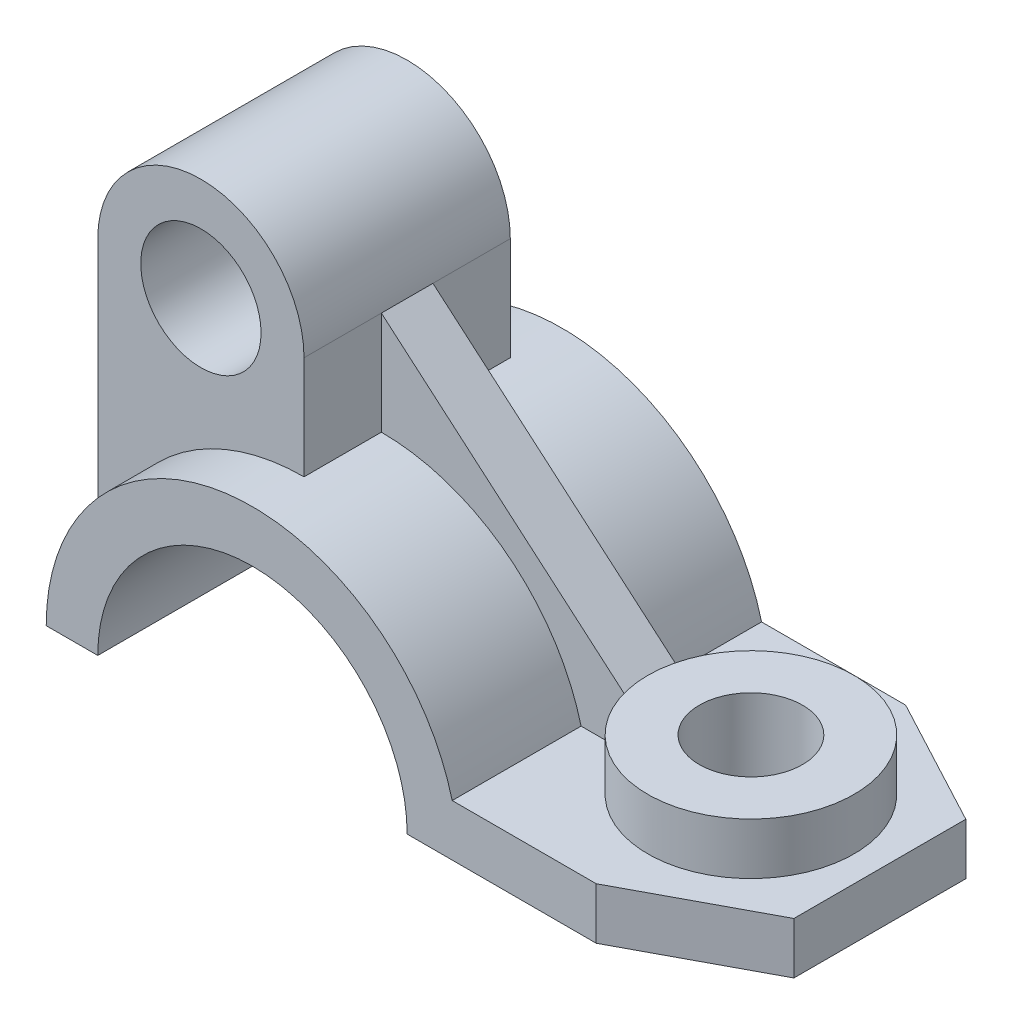
ISO-10303-21;
HEADER;
FILE_DESCRIPTION(('STEP AP214'),'2;1');
FILE_NAME('part.step','',(''),(''),'','','');
FILE_SCHEMA(('AUTOMOTIVE_DESIGN { 1 0 10303 214 1 1 1 1 }'));
ENDSEC;
DATA;
#1=APPLICATION_CONTEXT('core data for automotive mechanical design processes');
#2=APPLICATION_PROTOCOL_DEFINITION('international standard','automotive_design',2000,#1);
#3=PRODUCT_CONTEXT('',#1,'mechanical');
#4=PRODUCT('Part','Part','',(#3));
#5=PRODUCT_RELATED_PRODUCT_CATEGORY('part','',(#4));
#6=PRODUCT_DEFINITION_FORMATION('','',#4);
#7=PRODUCT_DEFINITION_CONTEXT('part definition',#1,'design');
#8=PRODUCT_DEFINITION('design','',#6,#7);
#9=PRODUCT_DEFINITION_SHAPE('','',#8);
#10=(LENGTH_UNIT() NAMED_UNIT(*) SI_UNIT(.MILLI.,.METRE.));
#11=(NAMED_UNIT(*) PLANE_ANGLE_UNIT() SI_UNIT($,.RADIAN.));
#12=(NAMED_UNIT(*) SI_UNIT($,.STERADIAN.) SOLID_ANGLE_UNIT());
#13=UNCERTAINTY_MEASURE_WITH_UNIT(LENGTH_MEASURE(1.E-05),#10,'distance_accuracy_value','');
#14=(GEOMETRIC_REPRESENTATION_CONTEXT(3) GLOBAL_UNCERTAINTY_ASSIGNED_CONTEXT((#13)) GLOBAL_UNIT_ASSIGNED_CONTEXT((#10,
#11,#12)) REPRESENTATION_CONTEXT('',''));
#15=CARTESIAN_POINT('',(0.,0.,0.));
#16=DIRECTION('',(0.,0.,1.));
#17=DIRECTION('',(1.,0.,0.));
#18=AXIS2_PLACEMENT_3D('',#15,#16,#17);
#19=CARTESIAN_POINT('',(0.,0.,18.));
#20=DIRECTION('',(0.,0.,-1.));
#21=DIRECTION('',(-1.,0.,0.));
#22=AXIS2_PLACEMENT_3D('',#19,#20,#21);
#23=CYLINDRICAL_SURFACE('',#22,24.);
#24=CARTESIAN_POINT('',(0.,0.,-3.));
#25=DIRECTION('',(0.,0.,1.));
#26=DIRECTION('',(1.,0.,0.));
#27=AXIS2_PLACEMENT_3D('',#24,#25,#26);
#28=CIRCLE('',#27,24.);
#29=CARTESIAN_POINT('',(23.2379000772445,5.99999999999999,-3.));
#30=VERTEX_POINT('',#29);
#31=CARTESIAN_POINT('',(0.,24.,-3.));
#32=VERTEX_POINT('',#31);
#33=EDGE_CURVE('E189',#30,#32,#28,.T.);
#34=ORIENTED_EDGE('',*,*,#33,.F.);
#35=DIRECTION('',(0.,0.,-1.));
#36=VECTOR('',#35,1.);
#37=CARTESIAN_POINT('',(23.2379000772445,5.99999999999999,18.));
#38=LINE('',#37,#36);
#39=CARTESIAN_POINT('',(23.2379000772445,5.99999999999999,-18.));
#40=VERTEX_POINT('',#39);
#41=EDGE_CURVE('E185',#30,#40,#38,.T.);
#42=ORIENTED_EDGE('',*,*,#41,.T.);
#43=CARTESIAN_POINT('',(0.,0.,-18.));
#44=DIRECTION('',(0.,0.,1.));
#45=DIRECTION('',(1.,0.,0.));
#46=AXIS2_PLACEMENT_3D('',#43,#44,#45);
#47=CIRCLE('',#46,24.);
#48=CARTESIAN_POINT('',(-24.,0.,-18.));
#49=VERTEX_POINT('',#48);
#50=EDGE_CURVE('E277',#40,#49,#47,.T.);
#51=ORIENTED_EDGE('',*,*,#50,.T.);
#52=DIRECTION('',(0.,0.,-1.));
#53=VECTOR('',#52,1.);
#54=CARTESIAN_POINT('',(-24.,0.,18.));
#55=LINE('',#54,#53);
#56=CARTESIAN_POINT('',(-24.,0.,-12.));
#57=VERTEX_POINT('',#56);
#58=EDGE_CURVE('E286',#57,#49,#55,.T.);
#59=ORIENTED_EDGE('',*,*,#58,.F.);
#60=CARTESIAN_POINT('',(0.,0.,-12.));
#61=DIRECTION('',(0.,0.,1.));
#62=DIRECTION('',(1.,0.,0.));
#63=AXIS2_PLACEMENT_3D('',#60,#61,#62);
#64=CIRCLE('',#63,24.);
#65=CARTESIAN_POINT('',(0.,24.,-12.));
#66=VERTEX_POINT('',#65);
#67=EDGE_CURVE('E393',#66,#57,#64,.T.);
#68=ORIENTED_EDGE('',*,*,#67,.F.);
#69=DIRECTION('',(0.,0.,-1.));
#70=VECTOR('',#69,1.);
#71=CARTESIAN_POINT('',(0.,24.,12.));
#72=LINE('',#71,#70);
#73=EDGE_CURVE('E350',#32,#66,#72,.T.);
#74=ORIENTED_EDGE('',*,*,#73,.F.);
#75=EDGE_LOOP('',(#34,#42,#51,#59,#68,#74));
#76=FACE_BOUND('',#75,.T.);
#77=ADVANCED_FACE('F47',(#76),#23,.T.);
#78=CARTESIAN_POINT('',(-2.54856103348659E-13,0.,12.));
#79=DIRECTION('',(1.,0.,0.));
#80=DIRECTION('',(0.,1.,0.));
#81=AXIS2_PLACEMENT_3D('',#78,#79,#80);
#82=PLANE('',#81);
#83=DIRECTION('',(0.,0.,-1.));
#84=VECTOR('',#83,1.);
#85=CARTESIAN_POINT('',(0.,36.,12.));
#86=LINE('',#85,#84);
#87=CARTESIAN_POINT('',(0.,36.,-3.));
#88=VERTEX_POINT('',#87);
#89=CARTESIAN_POINT('',(0.,36.,-12.));
#90=VERTEX_POINT('',#89);
#91=EDGE_CURVE('E269',#88,#90,#86,.T.);
#92=ORIENTED_EDGE('',*,*,#91,.F.);
#93=DIRECTION('',(0.,-1.,0.));
#94=VECTOR('',#93,1.);
#95=CARTESIAN_POINT('',(-2.54856103348659E-13,0.,-3.));
#96=LINE('',#95,#94);
#97=EDGE_CURVE('E683',#88,#32,#96,.T.);
#98=ORIENTED_EDGE('',*,*,#97,.T.);
#99=ORIENTED_EDGE('',*,*,#73,.T.);
#100=DIRECTION('',(0.,-1.,0.));
#101=VECTOR('',#100,1.);
#102=CARTESIAN_POINT('',(-2.54856103348659E-13,0.,-12.));
#103=LINE('',#102,#101);
#104=EDGE_CURVE('E361',#90,#66,#103,.T.);
#105=ORIENTED_EDGE('',*,*,#104,.F.);
#106=EDGE_LOOP('',(#92,#98,#99,#105));
#107=FACE_BOUND('',#106,.T.);
#108=ADVANCED_FACE('F314',(#107),#82,.T.);
#109=CARTESIAN_POINT('',(0.,0.,18.));
#110=DIRECTION('',(0.,0.,-1.));
#111=DIRECTION('',(-1.,0.,0.));
#112=AXIS2_PLACEMENT_3D('',#109,#110,#111);
#113=CYLINDRICAL_SURFACE('',#112,18.);
#114=DIRECTION('',(0.,0.,-1.));
#115=VECTOR('',#114,1.);
#116=CARTESIAN_POINT('',(-18.,0.,18.));
#117=LINE('',#116,#115);
#118=CARTESIAN_POINT('',(-18.,0.,18.));
#119=VERTEX_POINT('',#118);
#120=CARTESIAN_POINT('',(-18.,0.,-18.));
#121=VERTEX_POINT('',#120);
#122=EDGE_CURVE('E258',#119,#121,#117,.T.);
#123=ORIENTED_EDGE('',*,*,#122,.T.);
#124=CARTESIAN_POINT('',(0.,0.,-18.));
#125=DIRECTION('',(0.,0.,1.));
#126=DIRECTION('',(1.,0.,0.));
#127=AXIS2_PLACEMENT_3D('',#124,#125,#126);
#128=CIRCLE('',#127,18.);
#129=CARTESIAN_POINT('',(18.,0.,-18.));
#130=VERTEX_POINT('',#129);
#131=EDGE_CURVE('E256',#130,#121,#128,.T.);
#132=ORIENTED_EDGE('',*,*,#131,.F.);
#133=DIRECTION('',(0.,0.,-1.));
#134=VECTOR('',#133,1.);
#135=CARTESIAN_POINT('',(18.,0.,18.));
#136=LINE('',#135,#134);
#137=CARTESIAN_POINT('',(18.,0.,18.));
#138=VERTEX_POINT('',#137);
#139=EDGE_CURVE('E178',#138,#130,#136,.T.);
#140=ORIENTED_EDGE('',*,*,#139,.F.);
#141=CARTESIAN_POINT('',(0.,0.,18.));
#142=DIRECTION('',(0.,0.,1.));
#143=DIRECTION('',(1.,0.,0.));
#144=AXIS2_PLACEMENT_3D('',#141,#142,#143);
#145=CIRCLE('',#144,18.);
#146=EDGE_CURVE('E284',#138,#119,#145,.T.);
#147=ORIENTED_EDGE('',*,*,#146,.T.);
#148=EDGE_LOOP('',(#123,#132,#140,#147));
#149=FACE_BOUND('',#148,.T.);
#150=ADVANCED_FACE('F257',(#149),#113,.F.);
#151=CARTESIAN_POINT('',(0.,0.,18.));
#152=DIRECTION('',(0.,-1.,0.));
#153=DIRECTION('',(0.,0.,-1.));
#154=AXIS2_PLACEMENT_3D('',#151,#152,#153);
#155=PLANE('',#154);
#156=CARTESIAN_POINT('',(40.,0.,0.));
#157=DIRECTION('',(0.,-1.,0.));
#158=DIRECTION('',(0.,0.,-1.));
#159=AXIS2_PLACEMENT_3D('',#156,#157,#158);
#160=CIRCLE('',#159,5.99999999999999);
#161=CARTESIAN_POINT('',(40.,0.,-5.99999999999999));
#162=VERTEX_POINT('',#161);
#163=EDGE_CURVE('E692',#162,#162,#160,.T.);
#164=ORIENTED_EDGE('',*,*,#163,.F.);
#165=EDGE_LOOP('',(#164));
#166=FACE_BOUND('',#165,.T.);
#167=DIRECTION('',(-1.,0.,0.));
#168=VECTOR('',#167,1.);
#169=CARTESIAN_POINT('',(0.,0.,-18.));
#170=LINE('',#169,#168);
#171=CARTESIAN_POINT('',(39.9999999999999,0.,-18.));
#172=VERTEX_POINT('',#171);
#173=EDGE_CURVE('E249',#172,#130,#170,.T.);
#174=ORIENTED_EDGE('',*,*,#173,.F.);
#175=DIRECTION('',(-0.882352941176472,0.,-0.470588235294116));
#176=VECTOR('',#175,1.);
#177=CARTESIAN_POINT('',(23.8062283737023,0.,-26.636678200692));
#178=LINE('',#177,#176);
#179=CARTESIAN_POINT('',(55.,0.,-9.99999999999998));
#180=VERTEX_POINT('',#179);
#181=EDGE_CURVE('E11',#172,#180,#178,.F.);
#182=ORIENTED_EDGE('',*,*,#181,.T.);
#183=DIRECTION('',(0.,0.,-1.));
#184=VECTOR('',#183,1.);
#185=CARTESIAN_POINT('',(55.,0.,18.));
#186=LINE('',#185,#184);
#187=CARTESIAN_POINT('',(55.,0.,9.99999999999998));
#188=VERTEX_POINT('',#187);
#189=EDGE_CURVE('E230',#188,#180,#186,.T.);
#190=ORIENTED_EDGE('',*,*,#189,.F.);
#191=DIRECTION('',(-0.882352941176472,0.,0.470588235294116));
#192=VECTOR('',#191,1.);
#193=CARTESIAN_POINT('',(8.85813148788919,0.,34.6089965397923));
#194=LINE('',#193,#192);
#195=CARTESIAN_POINT('',(39.9999999999999,0.,18.));
#196=VERTEX_POINT('',#195);
#197=EDGE_CURVE('E213',#188,#196,#194,.T.);
#198=ORIENTED_EDGE('',*,*,#197,.T.);
#199=DIRECTION('',(-1.,0.,0.));
#200=VECTOR('',#199,1.);
#201=CARTESIAN_POINT('',(0.,0.,18.));
#202=LINE('',#201,#200);
#203=EDGE_CURVE('E251',#196,#138,#202,.T.);
#204=ORIENTED_EDGE('',*,*,#203,.T.);
#205=ORIENTED_EDGE('',*,*,#139,.T.);
#206=EDGE_LOOP('',(#174,#182,#190,#198,#204,#205));
#207=FACE_BOUND('',#206,.T.);
#208=ADVANCED_FACE('F248',(#166,#207),#155,.T.);
#209=CARTESIAN_POINT('',(55.,0.,18.));
#210=DIRECTION('',(-1.,0.,0.));
#211=DIRECTION('',(0.,0.,1.));
#212=AXIS2_PLACEMENT_3D('',#209,#210,#211);
#213=PLANE('',#212);
#214=ORIENTED_EDGE('',*,*,#189,.T.);
#215=DIRECTION('',(0.,1.,0.));
#216=VECTOR('',#215,1.);
#217=CARTESIAN_POINT('',(55.,0.,-9.99999999999998));
#218=LINE('',#217,#216);
#219=CARTESIAN_POINT('',(55.,6.,-9.99999999999998));
#220=VERTEX_POINT('',#219);
#221=EDGE_CURVE('E216',#180,#220,#218,.T.);
#222=ORIENTED_EDGE('',*,*,#221,.T.);
#223=DIRECTION('',(0.,0.,-1.));
#224=VECTOR('',#223,1.);
#225=CARTESIAN_POINT('',(55.,6.,18.));
#226=LINE('',#225,#224);
#227=CARTESIAN_POINT('',(55.,6.,9.99999999999998));
#228=VERTEX_POINT('',#227);
#229=EDGE_CURVE('E227',#228,#220,#226,.T.);
#230=ORIENTED_EDGE('',*,*,#229,.F.);
#231=DIRECTION('',(0.,-1.,0.));
#232=VECTOR('',#231,1.);
#233=CARTESIAN_POINT('',(55.,0.,9.99999999999998));
#234=LINE('',#233,#232);
#235=EDGE_CURVE('E210',#228,#188,#234,.T.);
#236=ORIENTED_EDGE('',*,*,#235,.T.);
#237=EDGE_LOOP('',(#214,#222,#230,#236));
#238=FACE_BOUND('',#237,.T.);
#239=ADVANCED_FACE('F226',(#238),#213,.F.);
#240=CARTESIAN_POINT('',(0.,5.99999999999999,18.));
#241=DIRECTION('',(0.,-1.,0.));
#242=DIRECTION('',(1.,0.,0.));
#243=AXIS2_PLACEMENT_3D('',#240,#241,#242);
#244=PLANE('',#243);
#245=ORIENTED_EDGE('',*,*,#229,.T.);
#246=DIRECTION('',(0.882352941176472,0.,0.470588235294116));
#247=VECTOR('',#246,1.);
#248=CARTESIAN_POINT('',(55.,6.,-9.99999999999998));
#249=LINE('',#248,#247);
#250=CARTESIAN_POINT('',(39.9999999999999,6.,-18.));
#251=VERTEX_POINT('',#250);
#252=EDGE_CURVE('E71',#220,#251,#249,.F.);
#253=ORIENTED_EDGE('',*,*,#252,.T.);
#254=DIRECTION('',(-1.,0.,0.));
#255=VECTOR('',#254,1.);
#256=CARTESIAN_POINT('',(0.,5.99999999999999,-18.));
#257=LINE('',#256,#255);
#258=EDGE_CURVE('E266',#251,#40,#257,.T.);
#259=ORIENTED_EDGE('',*,*,#258,.T.);
#260=ORIENTED_EDGE('',*,*,#41,.F.);
#261=DIRECTION('',(-1.,0.,0.));
#262=VECTOR('',#261,1.);
#263=CARTESIAN_POINT('',(0.,5.99999999999999,-3.));
#264=LINE('',#263,#262);
#265=CARTESIAN_POINT('',(28.3810499613777,6.,-3.));
#266=VERTEX_POINT('',#265);
#267=EDGE_CURVE('E182',#266,#30,#264,.T.);
#268=ORIENTED_EDGE('',*,*,#267,.F.);
#269=CARTESIAN_POINT('',(40.,6.,0.));
#270=DIRECTION('',(0.,-1.,0.));
#271=DIRECTION('',(1.,0.,0.));
#272=AXIS2_PLACEMENT_3D('',#269,#270,#271);
#273=CIRCLE('',#272,12.);
#274=CARTESIAN_POINT('',(28.3810499613777,6.,3.));
#275=VERTEX_POINT('',#274);
#276=EDGE_CURVE('E168',#275,#266,#273,.F.);
#277=ORIENTED_EDGE('',*,*,#276,.F.);
#278=DIRECTION('',(-1.,0.,0.));
#279=VECTOR('',#278,1.);
#280=CARTESIAN_POINT('',(0.,5.99999999999999,3.));
#281=LINE('',#280,#279);
#282=CARTESIAN_POINT('',(23.2379000772445,5.99999999999999,3.));
#283=VERTEX_POINT('',#282);
#284=EDGE_CURVE('E344',#275,#283,#281,.T.);
#285=ORIENTED_EDGE('',*,*,#284,.T.);
#286=CARTESIAN_POINT('',(23.2379000772445,5.99999999999999,18.));
#287=VERTEX_POINT('',#286);
#288=EDGE_CURVE('E235',#287,#283,#38,.T.);
#289=ORIENTED_EDGE('',*,*,#288,.F.);
#290=DIRECTION('',(-1.,0.,0.));
#291=VECTOR('',#290,1.);
#292=CARTESIAN_POINT('',(0.,5.99999999999999,18.));
#293=LINE('',#292,#291);
#294=CARTESIAN_POINT('',(39.9999999999999,6.,18.));
#295=VERTEX_POINT('',#294);
#296=EDGE_CURVE('E408',#295,#287,#293,.T.);
#297=ORIENTED_EDGE('',*,*,#296,.F.);
#298=DIRECTION('',(0.882352941176472,0.,-0.470588235294116));
#299=VECTOR('',#298,1.);
#300=CARTESIAN_POINT('',(39.9999999999999,6.,18.));
#301=LINE('',#300,#299);
#302=EDGE_CURVE('E207',#295,#228,#301,.T.);
#303=ORIENTED_EDGE('',*,*,#302,.T.);
#304=EDGE_LOOP('',(#245,#253,#259,#260,#268,#277,#285,#289,#297,#303));
#305=FACE_BOUND('',#304,.T.);
#306=ADVANCED_FACE('F183',(#305),#244,.F.);
#307=CARTESIAN_POINT('',(0.,0.,3.));
#308=DIRECTION('',(0.,0.,1.));
#309=DIRECTION('',(1.,0.,0.));
#310=AXIS2_PLACEMENT_3D('',#307,#308,#309);
#311=CIRCLE('',#310,24.);
#312=CARTESIAN_POINT('',(0.,24.,3.));
#313=VERTEX_POINT('',#312);
#314=EDGE_CURVE('E334',#283,#313,#311,.T.);
#315=ORIENTED_EDGE('',*,*,#314,.T.);
#316=CARTESIAN_POINT('',(0.,24.,12.));
#317=VERTEX_POINT('',#316);
#318=EDGE_CURVE('E337',#317,#313,#72,.T.);
#319=ORIENTED_EDGE('',*,*,#318,.F.);
#320=CARTESIAN_POINT('',(0.,0.,12.));
#321=DIRECTION('',(0.,0.,1.));
#322=DIRECTION('',(1.,0.,0.));
#323=AXIS2_PLACEMENT_3D('',#320,#321,#322);
#324=CIRCLE('',#323,24.);
#325=CARTESIAN_POINT('',(-24.,0.,12.));
#326=VERTEX_POINT('',#325);
#327=EDGE_CURVE('E375',#317,#326,#324,.T.);
#328=ORIENTED_EDGE('',*,*,#327,.T.);
#329=CARTESIAN_POINT('',(-24.,0.,18.));
#330=VERTEX_POINT('',#329);
#331=EDGE_CURVE('E287',#330,#326,#55,.T.);
#332=ORIENTED_EDGE('',*,*,#331,.F.);
#333=CARTESIAN_POINT('',(0.,0.,18.));
#334=DIRECTION('',(0.,0.,1.));
#335=DIRECTION('',(1.,0.,0.));
#336=AXIS2_PLACEMENT_3D('',#333,#334,#335);
#337=CIRCLE('',#336,24.);
#338=EDGE_CURVE('E410',#287,#330,#337,.T.);
#339=ORIENTED_EDGE('',*,*,#338,.F.);
#340=ORIENTED_EDGE('',*,*,#288,.T.);
#341=EDGE_LOOP('',(#315,#319,#328,#332,#339,#340));
#342=FACE_BOUND('',#341,.T.);
#343=ADVANCED_FACE('F320',(#342),#23,.T.);
#344=CARTESIAN_POINT('',(0.,0.,18.));
#345=DIRECTION('',(0.,-1.,0.));
#346=DIRECTION('',(0.,0.,-1.));
#347=AXIS2_PLACEMENT_3D('',#344,#345,#346);
#348=PLANE('',#347);
#349=DIRECTION('',(0.,0.,-1.));
#350=VECTOR('',#349,1.);
#351=CARTESIAN_POINT('',(-24.,0.,12.));
#352=LINE('',#351,#350);
#353=EDGE_CURVE('E297',#326,#57,#352,.T.);
#354=ORIENTED_EDGE('',*,*,#353,.T.);
#355=ORIENTED_EDGE('',*,*,#58,.T.);
#356=DIRECTION('',(-1.,0.,0.));
#357=VECTOR('',#356,1.);
#358=CARTESIAN_POINT('',(0.,0.,-18.));
#359=LINE('',#358,#357);
#360=EDGE_CURVE('E281',#121,#49,#359,.T.);
#361=ORIENTED_EDGE('',*,*,#360,.F.);
#362=ORIENTED_EDGE('',*,*,#122,.F.);
#363=DIRECTION('',(-1.,0.,0.));
#364=VECTOR('',#363,1.);
#365=CARTESIAN_POINT('',(0.,0.,18.));
#366=LINE('',#365,#364);
#367=EDGE_CURVE('E272',#119,#330,#366,.T.);
#368=ORIENTED_EDGE('',*,*,#367,.T.);
#369=ORIENTED_EDGE('',*,*,#331,.T.);
#370=EDGE_LOOP('',(#354,#355,#361,#362,#368,#369));
#371=FACE_BOUND('',#370,.T.);
#372=ADVANCED_FACE('F296',(#371),#348,.T.);
#373=CARTESIAN_POINT('',(0.,0.,18.));
#374=DIRECTION('',(0.,0.,1.));
#375=DIRECTION('',(1.,0.,0.));
#376=AXIS2_PLACEMENT_3D('',#373,#374,#375);
#377=PLANE('',#376);
#378=ORIENTED_EDGE('',*,*,#203,.F.);
#379=DIRECTION('',(0.,1.,0.));
#380=VECTOR('',#379,1.);
#381=CARTESIAN_POINT('',(39.9999999999999,6.,18.));
#382=LINE('',#381,#380);
#383=EDGE_CURVE('E200',#196,#295,#382,.T.);
#384=ORIENTED_EDGE('',*,*,#383,.T.);
#385=ORIENTED_EDGE('',*,*,#296,.T.);
#386=ORIENTED_EDGE('',*,*,#338,.T.);
#387=ORIENTED_EDGE('',*,*,#367,.F.);
#388=ORIENTED_EDGE('',*,*,#146,.F.);
#389=EDGE_LOOP('',(#378,#384,#385,#386,#387,#388));
#390=FACE_BOUND('',#389,.T.);
#391=ADVANCED_FACE('F305',(#390),#377,.T.);
#392=CARTESIAN_POINT('',(0.,0.,-18.));
#393=DIRECTION('',(0.,0.,1.));
#394=DIRECTION('',(1.,0.,0.));
#395=AXIS2_PLACEMENT_3D('',#392,#393,#394);
#396=PLANE('',#395);
#397=ORIENTED_EDGE('',*,*,#258,.F.);
#398=DIRECTION('',(0.,-1.,0.));
#399=VECTOR('',#398,1.);
#400=CARTESIAN_POINT('',(39.9999999999999,0.,-18.));
#401=LINE('',#400,#399);
#402=EDGE_CURVE('E57',#251,#172,#401,.T.);
#403=ORIENTED_EDGE('',*,*,#402,.T.);
#404=ORIENTED_EDGE('',*,*,#173,.T.);
#405=ORIENTED_EDGE('',*,*,#131,.T.);
#406=ORIENTED_EDGE('',*,*,#360,.T.);
#407=ORIENTED_EDGE('',*,*,#50,.F.);
#408=EDGE_LOOP('',(#397,#403,#404,#405,#406,#407));
#409=FACE_BOUND('',#408,.T.);
#410=ADVANCED_FACE('F302',(#409),#396,.F.);
#411=DIRECTION('',(0.,-1.,0.));
#412=VECTOR('',#411,1.);
#413=CARTESIAN_POINT('',(-2.54856103348659E-13,0.,3.));
#414=LINE('',#413,#412);
#415=CARTESIAN_POINT('',(0.,36.,3.));
#416=VERTEX_POINT('',#415);
#417=EDGE_CURVE('E343',#416,#313,#414,.T.);
#418=ORIENTED_EDGE('',*,*,#417,.F.);
#419=CARTESIAN_POINT('',(0.,36.,12.));
#420=VERTEX_POINT('',#419);
#421=EDGE_CURVE('E262',#420,#416,#86,.T.);
#422=ORIENTED_EDGE('',*,*,#421,.F.);
#423=DIRECTION('',(0.,-1.,0.));
#424=VECTOR('',#423,1.);
#425=CARTESIAN_POINT('',(-2.54856103348659E-13,0.,12.));
#426=LINE('',#425,#424);
#427=EDGE_CURVE('E347',#420,#317,#426,.T.);
#428=ORIENTED_EDGE('',*,*,#427,.T.);
#429=ORIENTED_EDGE('',*,*,#318,.T.);
#430=EDGE_LOOP('',(#418,#422,#428,#429));
#431=FACE_BOUND('',#430,.T.);
#432=ADVANCED_FACE('F304',(#431),#82,.T.);
#433=CARTESIAN_POINT('',(-12.,36.,12.));
#434=DIRECTION('',(0.,0.,-1.));
#435=DIRECTION('',(-1.,0.,0.));
#436=AXIS2_PLACEMENT_3D('',#433,#434,#435);
#437=CYLINDRICAL_SURFACE('',#436,12.);
#438=CARTESIAN_POINT('',(-12.,36.,-12.));
#439=DIRECTION('',(0.,0.,1.));
#440=DIRECTION('',(1.,0.,0.));
#441=AXIS2_PLACEMENT_3D('',#438,#439,#440);
#442=CIRCLE('',#441,12.);
#443=CARTESIAN_POINT('',(-24.,36.,-12.));
#444=VERTEX_POINT('',#443);
#445=EDGE_CURVE('E385',#90,#444,#442,.T.);
#446=ORIENTED_EDGE('',*,*,#445,.T.);
#447=DIRECTION('',(0.,0.,-1.));
#448=VECTOR('',#447,1.);
#449=CARTESIAN_POINT('',(-24.,36.,12.));
#450=LINE('',#449,#448);
#451=CARTESIAN_POINT('',(-24.,36.,12.));
#452=VERTEX_POINT('',#451);
#453=EDGE_CURVE('E401',#452,#444,#450,.T.);
#454=ORIENTED_EDGE('',*,*,#453,.F.);
#455=CARTESIAN_POINT('',(-12.,36.,12.));
#456=DIRECTION('',(0.,0.,1.));
#457=DIRECTION('',(1.,0.,0.));
#458=AXIS2_PLACEMENT_3D('',#455,#456,#457);
#459=CIRCLE('',#458,12.);
#460=EDGE_CURVE('E367',#420,#452,#459,.T.);
#461=ORIENTED_EDGE('',*,*,#460,.F.);
#462=ORIENTED_EDGE('',*,*,#421,.T.);
#463=DIRECTION('',(0.,0.,-1.));
#464=VECTOR('',#463,1.);
#465=CARTESIAN_POINT('',(0.,36.,12.));
#466=LINE('',#465,#464);
#467=EDGE_CURVE('E190',#416,#88,#466,.T.);
#468=ORIENTED_EDGE('',*,*,#467,.T.);
#469=ORIENTED_EDGE('',*,*,#91,.T.);
#470=EDGE_LOOP('',(#446,#454,#461,#462,#468,#469));
#471=FACE_BOUND('',#470,.T.);
#472=ADVANCED_FACE('F311',(#471),#437,.T.);
#473=CARTESIAN_POINT('',(-24.,0.,12.));
#474=DIRECTION('',(-1.,0.,0.));
#475=DIRECTION('',(0.,0.,1.));
#476=AXIS2_PLACEMENT_3D('',#473,#474,#475);
#477=PLANE('',#476);
#478=ORIENTED_EDGE('',*,*,#453,.T.);
#479=DIRECTION('',(0.,1.,0.));
#480=VECTOR('',#479,1.);
#481=CARTESIAN_POINT('',(-24.,0.,-12.));
#482=LINE('',#481,#480);
#483=EDGE_CURVE('E389',#57,#444,#482,.T.);
#484=ORIENTED_EDGE('',*,*,#483,.F.);
#485=ORIENTED_EDGE('',*,*,#353,.F.);
#486=DIRECTION('',(0.,1.,0.));
#487=VECTOR('',#486,1.);
#488=CARTESIAN_POINT('',(-24.,0.,12.));
#489=LINE('',#488,#487);
#490=EDGE_CURVE('E371',#326,#452,#489,.T.);
#491=ORIENTED_EDGE('',*,*,#490,.T.);
#492=EDGE_LOOP('',(#478,#484,#485,#491));
#493=FACE_BOUND('',#492,.T.);
#494=ADVANCED_FACE('F570',(#493),#477,.T.);
#495=CARTESIAN_POINT('',(-12.,36.,12.));
#496=DIRECTION('',(0.,0.,-1.));
#497=DIRECTION('',(-1.,0.,0.));
#498=AXIS2_PLACEMENT_3D('',#495,#496,#497);
#499=CYLINDRICAL_SURFACE('',#498,7.);
#500=CARTESIAN_POINT('',(-12.,36.,12.));
#501=DIRECTION('',(0.,0.,1.));
#502=DIRECTION('',(1.,0.,0.));
#503=AXIS2_PLACEMENT_3D('',#500,#501,#502);
#504=CIRCLE('',#503,7.);
#505=CARTESIAN_POINT('',(-5.,36.,12.));
#506=VERTEX_POINT('',#505);
#507=EDGE_CURVE('E378',#506,#506,#504,.T.);
#508=ORIENTED_EDGE('',*,*,#507,.T.);
#509=EDGE_LOOP('',(#508));
#510=FACE_BOUND('',#509,.T.);
#511=CARTESIAN_POINT('',(-12.,36.,-12.));
#512=DIRECTION('',(0.,0.,1.));
#513=DIRECTION('',(1.,0.,0.));
#514=AXIS2_PLACEMENT_3D('',#511,#512,#513);
#515=CIRCLE('',#514,7.);
#516=CARTESIAN_POINT('',(-5.,36.,-12.));
#517=VERTEX_POINT('',#516);
#518=EDGE_CURVE('E368',#517,#517,#515,.T.);
#519=ORIENTED_EDGE('',*,*,#518,.F.);
#520=EDGE_LOOP('',(#519));
#521=FACE_BOUND('',#520,.T.);
#522=ADVANCED_FACE('F561',(#510,#521),#499,.F.);
#523=CARTESIAN_POINT('',(0.,0.,12.));
#524=DIRECTION('',(0.,0.,1.));
#525=DIRECTION('',(1.,0.,0.));
#526=AXIS2_PLACEMENT_3D('',#523,#524,#525);
#527=PLANE('',#526);
#528=ORIENTED_EDGE('',*,*,#427,.F.);
#529=ORIENTED_EDGE('',*,*,#460,.T.);
#530=ORIENTED_EDGE('',*,*,#490,.F.);
#531=ORIENTED_EDGE('',*,*,#327,.F.);
#532=EDGE_LOOP('',(#528,#529,#530,#531));
#533=FACE_BOUND('',#532,.T.);
#534=ORIENTED_EDGE('',*,*,#507,.F.);
#535=EDGE_LOOP('',(#534));
#536=FACE_BOUND('',#535,.T.);
#537=ADVANCED_FACE('F551',(#533,#536),#527,.T.);
#538=CARTESIAN_POINT('',(0.,0.,-12.));
#539=DIRECTION('',(0.,0.,1.));
#540=DIRECTION('',(1.,0.,0.));
#541=AXIS2_PLACEMENT_3D('',#538,#539,#540);
#542=PLANE('',#541);
#543=ORIENTED_EDGE('',*,*,#104,.T.);
#544=ORIENTED_EDGE('',*,*,#67,.T.);
#545=ORIENTED_EDGE('',*,*,#483,.T.);
#546=ORIENTED_EDGE('',*,*,#445,.F.);
#547=EDGE_LOOP('',(#543,#544,#545,#546));
#548=FACE_BOUND('',#547,.T.);
#549=ORIENTED_EDGE('',*,*,#518,.T.);
#550=EDGE_LOOP('',(#549));
#551=FACE_BOUND('',#550,.T.);
#552=ADVANCED_FACE('F541',(#548,#551),#542,.F.);
#553=CARTESIAN_POINT('',(40.,12.,0.));
#554=DIRECTION('',(0.,-1.,0.));
#555=DIRECTION('',(1.,0.,0.));
#556=AXIS2_PLACEMENT_3D('',#553,#554,#555);
#557=CYLINDRICAL_SURFACE('',#556,12.);
#558=CARTESIAN_POINT('',(40.,1.71428571428571,0.));
#559=DIRECTION('',(-0.650791373455969,-0.759256602365297,0.));
#560=DIRECTION('',(0.759256602365297,-0.650791373455969,0.));
#561=AXIS2_PLACEMENT_3D('',#558,#559,#560);
#562=ELLIPSE('',#561,15.8049333553592,12.);
#563=CARTESIAN_POINT('',(28.,12.,0.));
#564=VERTEX_POINT('',#563);
#565=CARTESIAN_POINT('',(28.3810499613777,11.6733857473905,3.));
#566=VERTEX_POINT('',#565);
#567=EDGE_CURVE('E677',#564,#566,#562,.F.);
#568=ORIENTED_EDGE('',*,*,#567,.T.);
#569=DIRECTION('',(0.,-1.,0.));
#570=VECTOR('',#569,1.);
#571=CARTESIAN_POINT('',(28.3810499613777,12.,3.));
#572=LINE('',#571,#570);
#573=EDGE_CURVE('E175',#566,#275,#572,.T.);
#574=ORIENTED_EDGE('',*,*,#573,.T.);
#575=ORIENTED_EDGE('',*,*,#276,.T.);
#576=DIRECTION('',(0.,-1.,0.));
#577=VECTOR('',#576,1.);
#578=CARTESIAN_POINT('',(28.3810499613777,12.,-3.));
#579=LINE('',#578,#577);
#580=CARTESIAN_POINT('',(28.3810499613777,11.6733857473905,-3.));
#581=VERTEX_POINT('',#580);
#582=EDGE_CURVE('E172',#581,#266,#579,.T.);
#583=ORIENTED_EDGE('',*,*,#582,.F.);
#584=EDGE_CURVE('E674',#581,#564,#562,.F.);
#585=ORIENTED_EDGE('',*,*,#584,.T.);
#586=CARTESIAN_POINT('',(40.,12.,0.));
#587=DIRECTION('',(0.,1.,0.));
#588=DIRECTION('',(-1.,0.,0.));
#589=AXIS2_PLACEMENT_3D('',#586,#587,#588);
#590=CIRCLE('',#589,12.);
#591=EDGE_CURVE('E357',#564,#564,#590,.T.);
#592=ORIENTED_EDGE('',*,*,#591,.F.);
#593=EDGE_LOOP('',(#568,#574,#575,#583,#585,#592));
#594=FACE_BOUND('',#593,.T.);
#595=ADVANCED_FACE('F170',(#594),#557,.T.);
#596=CARTESIAN_POINT('',(40.,12.,0.));
#597=DIRECTION('',(0.,1.,0.));
#598=DIRECTION('',(-1.,0.,0.));
#599=AXIS2_PLACEMENT_3D('',#596,#597,#598);
#600=PLANE('',#599);
#601=CARTESIAN_POINT('',(40.,12.,0.));
#602=DIRECTION('',(0.,1.,0.));
#603=DIRECTION('',(0.,0.,1.));
#604=AXIS2_PLACEMENT_3D('',#601,#602,#603);
#605=CIRCLE('',#604,6.);
#606=CARTESIAN_POINT('',(40.,12.,6.));
#607=VERTEX_POINT('',#606);
#608=EDGE_CURVE('E698',#607,#607,#605,.T.);
#609=ORIENTED_EDGE('',*,*,#608,.F.);
#610=EDGE_LOOP('',(#609));
#611=FACE_BOUND('',#610,.T.);
#612=ORIENTED_EDGE('',*,*,#591,.T.);
#613=EDGE_LOOP('',(#612));
#614=FACE_BOUND('',#613,.T.);
#615=ADVANCED_FACE('F474',(#611,#614),#600,.T.);
#616=CARTESIAN_POINT('',(0.,36.,0.));
#617=DIRECTION('',(-0.650791373455969,-0.759256602365297,0.));
#618=DIRECTION('',(0.759256602365297,-0.650791373455969,0.));
#619=AXIS2_PLACEMENT_3D('',#616,#617,#618);
#620=PLANE('',#619);
#621=ORIENTED_EDGE('',*,*,#467,.F.);
#622=DIRECTION('',(0.759256602365297,-0.650791373455969,0.));
#623=VECTOR('',#622,1.);
#624=CARTESIAN_POINT('',(0.,36.,3.));
#625=LINE('',#624,#623);
#626=EDGE_CURVE('E355',#416,#566,#625,.T.);
#627=ORIENTED_EDGE('',*,*,#626,.T.);
#628=ORIENTED_EDGE('',*,*,#567,.F.);
#629=ORIENTED_EDGE('',*,*,#584,.F.);
#630=DIRECTION('',(0.759256602365297,-0.650791373455969,0.));
#631=VECTOR('',#630,1.);
#632=CARTESIAN_POINT('',(0.,36.,-3.));
#633=LINE('',#632,#631);
#634=EDGE_CURVE('E196',#88,#581,#633,.T.);
#635=ORIENTED_EDGE('',*,*,#634,.F.);
#636=EDGE_LOOP('',(#621,#627,#628,#629,#635));
#637=FACE_BOUND('',#636,.T.);
#638=ADVANCED_FACE('F479',(#637),#620,.F.);
#639=CARTESIAN_POINT('',(15.5,24.,3.));
#640=DIRECTION('',(0.,0.,1.));
#641=DIRECTION('',(1.,0.,0.));
#642=AXIS2_PLACEMENT_3D('',#639,#640,#641);
#643=PLANE('',#642);
#644=ORIENTED_EDGE('',*,*,#417,.T.);
#645=ORIENTED_EDGE('',*,*,#314,.F.);
#646=ORIENTED_EDGE('',*,*,#284,.F.);
#647=ORIENTED_EDGE('',*,*,#573,.F.);
#648=ORIENTED_EDGE('',*,*,#626,.F.);
#649=EDGE_LOOP('',(#644,#645,#646,#647,#648));
#650=FACE_BOUND('',#649,.T.);
#651=ADVANCED_FACE('F353',(#650),#643,.T.);
#652=CARTESIAN_POINT('',(15.5,24.,-3.));
#653=DIRECTION('',(0.,0.,1.));
#654=DIRECTION('',(1.,0.,0.));
#655=AXIS2_PLACEMENT_3D('',#652,#653,#654);
#656=PLANE('',#655);
#657=ORIENTED_EDGE('',*,*,#97,.F.);
#658=ORIENTED_EDGE('',*,*,#634,.T.);
#659=ORIENTED_EDGE('',*,*,#582,.T.);
#660=ORIENTED_EDGE('',*,*,#267,.T.);
#661=ORIENTED_EDGE('',*,*,#33,.T.);
#662=EDGE_LOOP('',(#657,#658,#659,#660,#661));
#663=FACE_BOUND('',#662,.T.);
#664=ADVANCED_FACE('F194',(#663),#656,.F.);
#665=CARTESIAN_POINT('',(39.9999999999999,0.,18.));
#666=DIRECTION('',(0.470588235294116,0.,0.882352941176471));
#667=DIRECTION('',(0.,-1.,0.));
#668=AXIS2_PLACEMENT_3D('',#665,#666,#667);
#669=PLANE('',#668);
#670=ORIENTED_EDGE('',*,*,#197,.F.);
#671=ORIENTED_EDGE('',*,*,#235,.F.);
#672=ORIENTED_EDGE('',*,*,#302,.F.);
#673=ORIENTED_EDGE('',*,*,#383,.F.);
#674=EDGE_LOOP('',(#670,#671,#672,#673));
#675=FACE_BOUND('',#674,.T.);
#676=ADVANCED_FACE('F417',(#675),#669,.T.);
#677=CARTESIAN_POINT('',(55.,0.,-9.99999999999998));
#678=DIRECTION('',(-0.470588235294116,0.,0.882352941176472));
#679=DIRECTION('',(0.,1.,0.));
#680=AXIS2_PLACEMENT_3D('',#677,#678,#679);
#681=PLANE('',#680);
#682=ORIENTED_EDGE('',*,*,#181,.F.);
#683=ORIENTED_EDGE('',*,*,#402,.F.);
#684=ORIENTED_EDGE('',*,*,#252,.F.);
#685=ORIENTED_EDGE('',*,*,#221,.F.);
#686=EDGE_LOOP('',(#682,#683,#684,#685));
#687=FACE_BOUND('',#686,.T.);
#688=ADVANCED_FACE('F50',(#687),#681,.F.);
#689=CARTESIAN_POINT('',(40.,12.,0.));
#690=DIRECTION('',(0.,1.,0.));
#691=DIRECTION('',(0.,0.,1.));
#692=AXIS2_PLACEMENT_3D('',#689,#690,#691);
#693=CYLINDRICAL_SURFACE('',#692,5.99999999999999);
#694=ORIENTED_EDGE('',*,*,#163,.T.);
#695=EDGE_LOOP('',(#694));
#696=FACE_BOUND('',#695,.T.);
#697=ORIENTED_EDGE('',*,*,#608,.T.);
#698=EDGE_LOOP('',(#697));
#699=FACE_BOUND('',#698,.T.);
#700=ADVANCED_FACE('F419',(#696,#699),#693,.F.);
#701=CLOSED_SHELL('',(#77,#108,#150,#208,#239,#306,#343,#372,#391,#410,#432,#472,#494,#522,#537,
#552,#595,#615,#638,#651,#664,#676,#688,#700));
#702=MANIFOLD_SOLID_BREP('B2',#701);
#703=ADVANCED_BREP_SHAPE_REPRESENTATION('',(#18,#702),#14);
#704=SHAPE_DEFINITION_REPRESENTATION(#9,#703);
ENDSEC;
END-ISO-10303-21;
